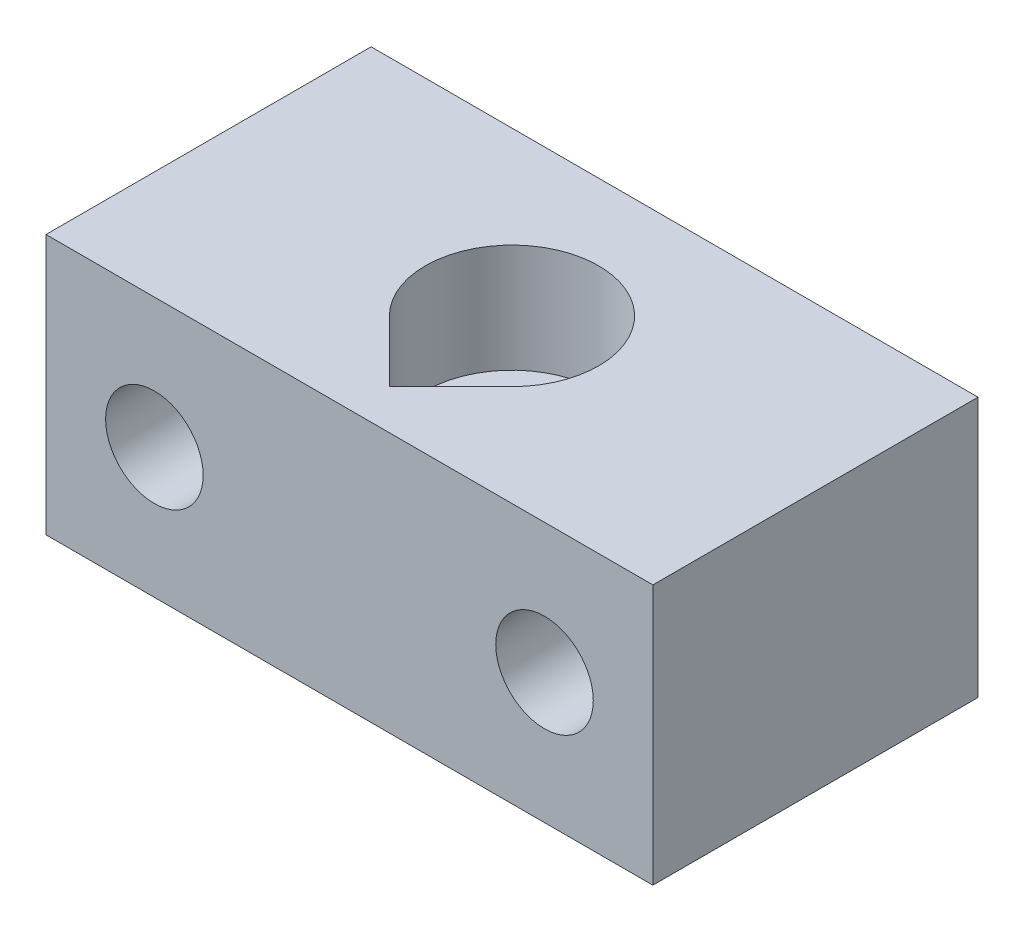
ISO-10303-21;
HEADER;
FILE_DESCRIPTION(('STEP AP214'),'2;1');
FILE_NAME('part.step','',(''),(''),'','','');
FILE_SCHEMA(('AUTOMOTIVE_DESIGN { 1 0 10303 214 1 1 1 1 }'));
ENDSEC;
DATA;
#1=APPLICATION_CONTEXT('core data for automotive mechanical design processes');
#2=APPLICATION_PROTOCOL_DEFINITION('international standard','automotive_design',2000,#1);
#3=PRODUCT_CONTEXT('',#1,'mechanical');
#4=PRODUCT('Part','Part','',(#3));
#5=PRODUCT_RELATED_PRODUCT_CATEGORY('part','',(#4));
#6=PRODUCT_DEFINITION_FORMATION('','',#4);
#7=PRODUCT_DEFINITION_CONTEXT('part definition',#1,'design');
#8=PRODUCT_DEFINITION('design','',#6,#7);
#9=PRODUCT_DEFINITION_SHAPE('','',#8);
#10=(LENGTH_UNIT() NAMED_UNIT(*) SI_UNIT(.MILLI.,.METRE.));
#11=(NAMED_UNIT(*) PLANE_ANGLE_UNIT() SI_UNIT($,.RADIAN.));
#12=(NAMED_UNIT(*) SI_UNIT($,.STERADIAN.) SOLID_ANGLE_UNIT());
#13=UNCERTAINTY_MEASURE_WITH_UNIT(LENGTH_MEASURE(1.E-05),#10,'distance_accuracy_value','');
#14=(GEOMETRIC_REPRESENTATION_CONTEXT(3) GLOBAL_UNCERTAINTY_ASSIGNED_CONTEXT((#13)) GLOBAL_UNIT_ASSIGNED_CONTEXT((#10,
#11,#12)) REPRESENTATION_CONTEXT('',''));
#15=CARTESIAN_POINT('',(0.,0.,0.));
#16=DIRECTION('',(0.,0.,1.));
#17=DIRECTION('',(1.,0.,0.));
#18=AXIS2_PLACEMENT_3D('',#15,#16,#17);
#19=CARTESIAN_POINT('',(0.,12.,-7.5));
#20=DIRECTION('',(0.,-1.,0.));
#21=DIRECTION('',(0.,0.,-1.));
#22=AXIS2_PLACEMENT_3D('',#19,#20,#21);
#23=CYLINDRICAL_SURFACE('',#22,2.25);
#24=DIRECTION('',(0.,-1.,0.));
#25=VECTOR('',#24,1.);
#26=CARTESIAN_POINT('',(1.59099025766973,12.,-5.90900974233027));
#27=LINE('',#26,#25);
#28=CARTESIAN_POINT('',(1.59099025766973,7.,-5.90900974233027));
#29=VERTEX_POINT('',#28);
#30=CARTESIAN_POINT('',(1.59099025766973,0.,-5.90900974233027));
#31=VERTEX_POINT('',#30);
#32=EDGE_CURVE('E172',#29,#31,#27,.T.);
#33=ORIENTED_EDGE('',*,*,#32,.F.);
#34=CARTESIAN_POINT('',(0.,7.,-7.5));
#35=DIRECTION('',(0.,1.,0.));
#36=DIRECTION('',(0.,0.,1.));
#37=AXIS2_PLACEMENT_3D('',#34,#35,#36);
#38=CIRCLE('',#37,2.25);
#39=CARTESIAN_POINT('',(-1.59099025766973,7.,-5.90900974233027));
#40=VERTEX_POINT('',#39);
#41=EDGE_CURVE('E57',#29,#40,#38,.T.);
#42=ORIENTED_EDGE('',*,*,#41,.T.);
#43=DIRECTION('',(0.,-1.,0.));
#44=VECTOR('',#43,1.);
#45=CARTESIAN_POINT('',(-1.59099025766973,12.,-5.90900974233027));
#46=LINE('',#45,#44);
#47=CARTESIAN_POINT('',(-1.59099025766973,0.,-5.90900974233027));
#48=VERTEX_POINT('',#47);
#49=EDGE_CURVE('E176',#40,#48,#46,.T.);
#50=ORIENTED_EDGE('',*,*,#49,.T.);
#51=CARTESIAN_POINT('',(0.,0.,-7.5));
#52=DIRECTION('',(0.,1.,0.));
#53=DIRECTION('',(0.,0.,1.));
#54=AXIS2_PLACEMENT_3D('',#51,#52,#53);
#55=CIRCLE('',#54,2.25);
#56=EDGE_CURVE('E163',#31,#48,#55,.T.);
#57=ORIENTED_EDGE('',*,*,#56,.F.);
#58=EDGE_LOOP('',(#33,#42,#50,#57));
#59=FACE_BOUND('',#58,.T.);
#60=ADVANCED_FACE('F34',(#59),#23,.F.);
#61=CARTESIAN_POINT('',(-1.59099025766973,12.,-5.90900974233027));
#62=DIRECTION('',(0.707106781186548,0.,-0.707106781186547));
#63=DIRECTION('',(-0.707106781186547,0.,-0.707106781186548));
#64=AXIS2_PLACEMENT_3D('',#61,#62,#63);
#65=PLANE('',#64);
#66=ORIENTED_EDGE('',*,*,#49,.F.);
#67=DIRECTION('',(0.707106781186547,0.,0.707106781186548));
#68=VECTOR('',#67,1.);
#69=CARTESIAN_POINT('',(-1.59099025766973,7.,-5.90900974233027));
#70=LINE('',#69,#68);
#71=CARTESIAN_POINT('',(0.,7.,-4.31801948466054));
#72=VERTEX_POINT('',#71);
#73=EDGE_CURVE('E138',#40,#72,#70,.T.);
#74=ORIENTED_EDGE('',*,*,#73,.T.);
#75=DIRECTION('',(0.,-1.,0.));
#76=VECTOR('',#75,1.);
#77=CARTESIAN_POINT('',(0.,12.,-4.31801948466054));
#78=LINE('',#77,#76);
#79=CARTESIAN_POINT('',(0.,0.,-4.31801948466054));
#80=VERTEX_POINT('',#79);
#81=EDGE_CURVE('E174',#72,#80,#78,.T.);
#82=ORIENTED_EDGE('',*,*,#81,.T.);
#83=DIRECTION('',(0.707106781186547,0.,0.707106781186548));
#84=VECTOR('',#83,1.);
#85=CARTESIAN_POINT('',(-1.59099025766973,0.,-5.90900974233027));
#86=LINE('',#85,#84);
#87=EDGE_CURVE('E166',#48,#80,#86,.T.);
#88=ORIENTED_EDGE('',*,*,#87,.F.);
#89=EDGE_LOOP('',(#66,#74,#82,#88));
#90=FACE_BOUND('',#89,.T.);
#91=ADVANCED_FACE('F247',(#90),#65,.T.);
#92=CARTESIAN_POINT('',(0.,12.,-4.31801948466054));
#93=DIRECTION('',(-0.707106781186548,0.,-0.707106781186547));
#94=DIRECTION('',(-0.707106781186547,0.,0.707106781186548));
#95=AXIS2_PLACEMENT_3D('',#92,#93,#94);
#96=PLANE('',#95);
#97=ORIENTED_EDGE('',*,*,#81,.F.);
#98=DIRECTION('',(0.707106781186547,0.,-0.707106781186548));
#99=VECTOR('',#98,1.);
#100=CARTESIAN_POINT('',(0.,7.,-4.31801948466054));
#101=LINE('',#100,#99);
#102=EDGE_CURVE('E11',#72,#29,#101,.T.);
#103=ORIENTED_EDGE('',*,*,#102,.T.);
#104=ORIENTED_EDGE('',*,*,#32,.T.);
#105=DIRECTION('',(0.707106781186547,0.,-0.707106781186548));
#106=VECTOR('',#105,1.);
#107=CARTESIAN_POINT('',(0.,0.,-4.31801948466054));
#108=LINE('',#107,#106);
#109=EDGE_CURVE('E169',#80,#31,#108,.T.);
#110=ORIENTED_EDGE('',*,*,#109,.F.);
#111=EDGE_LOOP('',(#97,#103,#104,#110));
#112=FACE_BOUND('',#111,.T.);
#113=ADVANCED_FACE('F239',(#112),#96,.T.);
#114=CARTESIAN_POINT('',(0.,12.,0.));
#115=DIRECTION('',(0.,1.,0.));
#116=DIRECTION('',(0.,0.,1.));
#117=AXIS2_PLACEMENT_3D('',#114,#115,#116);
#118=PLANE('',#117);
#119=CARTESIAN_POINT('',(0.,12.,-7.5));
#120=DIRECTION('',(0.,1.,0.));
#121=DIRECTION('',(0.,0.,1.));
#122=AXIS2_PLACEMENT_3D('',#119,#120,#121);
#123=CIRCLE('',#122,4.);
#124=CARTESIAN_POINT('',(2.82842712474619,12.,-4.67157287525381));
#125=VERTEX_POINT('',#124);
#126=CARTESIAN_POINT('',(-2.82842712474619,12.,-4.67157287525381));
#127=VERTEX_POINT('',#126);
#128=EDGE_CURVE('E49',#125,#127,#123,.T.);
#129=ORIENTED_EDGE('',*,*,#128,.F.);
#130=DIRECTION('',(0.707106781186547,0.,-0.707106781186548));
#131=VECTOR('',#130,1.);
#132=CARTESIAN_POINT('',(0.,12.,-1.84314575050762));
#133=LINE('',#132,#131);
#134=CARTESIAN_POINT('',(0.,12.,-1.84314575050762));
#135=VERTEX_POINT('',#134);
#136=EDGE_CURVE('E127',#135,#125,#133,.T.);
#137=ORIENTED_EDGE('',*,*,#136,.F.);
#138=DIRECTION('',(0.707106781186547,0.,0.707106781186548));
#139=VECTOR('',#138,1.);
#140=CARTESIAN_POINT('',(-2.82842712474619,12.,-4.67157287525381));
#141=LINE('',#140,#139);
#142=EDGE_CURVE('E130',#127,#135,#141,.T.);
#143=ORIENTED_EDGE('',*,*,#142,.F.);
#144=EDGE_LOOP('',(#129,#137,#143));
#145=FACE_BOUND('',#144,.T.);
#146=DIRECTION('',(-1.,0.,0.));
#147=VECTOR('',#146,1.);
#148=CARTESIAN_POINT('',(-14.,12.,0.));
#149=LINE('',#148,#147);
#150=CARTESIAN_POINT('',(14.,12.,0.));
#151=VERTEX_POINT('',#150);
#152=CARTESIAN_POINT('',(-14.,12.,0.));
#153=VERTEX_POINT('',#152);
#154=EDGE_CURVE('E143',#151,#153,#149,.T.);
#155=ORIENTED_EDGE('',*,*,#154,.F.);
#156=DIRECTION('',(0.,0.,-1.));
#157=VECTOR('',#156,1.);
#158=CARTESIAN_POINT('',(14.,12.,-15.));
#159=LINE('',#158,#157);
#160=CARTESIAN_POINT('',(14.,12.,-15.));
#161=VERTEX_POINT('',#160);
#162=EDGE_CURVE('E182',#151,#161,#159,.T.);
#163=ORIENTED_EDGE('',*,*,#162,.T.);
#164=DIRECTION('',(-1.,0.,0.));
#165=VECTOR('',#164,1.);
#166=CARTESIAN_POINT('',(-14.,12.,-15.));
#167=LINE('',#166,#165);
#168=CARTESIAN_POINT('',(-14.,12.,-15.));
#169=VERTEX_POINT('',#168);
#170=EDGE_CURVE('E185',#161,#169,#167,.T.);
#171=ORIENTED_EDGE('',*,*,#170,.T.);
#172=DIRECTION('',(0.,0.,1.));
#173=VECTOR('',#172,1.);
#174=CARTESIAN_POINT('',(-14.,12.,-15.));
#175=LINE('',#174,#173);
#176=EDGE_CURVE('E179',#169,#153,#175,.T.);
#177=ORIENTED_EDGE('',*,*,#176,.T.);
#178=EDGE_LOOP('',(#155,#163,#171,#177));
#179=FACE_BOUND('',#178,.T.);
#180=ADVANCED_FACE('F237',(#145,#179),#118,.T.);
#181=CARTESIAN_POINT('',(0.,0.,0.));
#182=DIRECTION('',(0.,1.,0.));
#183=DIRECTION('',(0.,0.,1.));
#184=AXIS2_PLACEMENT_3D('',#181,#182,#183);
#185=PLANE('',#184);
#186=DIRECTION('',(0.,0.,-1.));
#187=VECTOR('',#186,1.);
#188=CARTESIAN_POINT('',(14.,0.,-15.));
#189=LINE('',#188,#187);
#190=CARTESIAN_POINT('',(14.,0.,0.));
#191=VERTEX_POINT('',#190);
#192=CARTESIAN_POINT('',(14.,0.,-15.));
#193=VERTEX_POINT('',#192);
#194=EDGE_CURVE('E190',#191,#193,#189,.T.);
#195=ORIENTED_EDGE('',*,*,#194,.F.);
#196=DIRECTION('',(-1.,0.,0.));
#197=VECTOR('',#196,1.);
#198=CARTESIAN_POINT('',(-14.,0.,0.));
#199=LINE('',#198,#197);
#200=CARTESIAN_POINT('',(-14.,0.,0.));
#201=VERTEX_POINT('',#200);
#202=EDGE_CURVE('E144',#191,#201,#199,.T.);
#203=ORIENTED_EDGE('',*,*,#202,.T.);
#204=DIRECTION('',(0.,0.,1.));
#205=VECTOR('',#204,1.);
#206=CARTESIAN_POINT('',(-14.,0.,-15.));
#207=LINE('',#206,#205);
#208=CARTESIAN_POINT('',(-14.,0.,-15.));
#209=VERTEX_POINT('',#208);
#210=EDGE_CURVE('E178',#209,#201,#207,.T.);
#211=ORIENTED_EDGE('',*,*,#210,.F.);
#212=DIRECTION('',(-1.,0.,0.));
#213=VECTOR('',#212,1.);
#214=CARTESIAN_POINT('',(-14.,0.,-15.));
#215=LINE('',#214,#213);
#216=EDGE_CURVE('E183',#193,#209,#215,.T.);
#217=ORIENTED_EDGE('',*,*,#216,.F.);
#218=EDGE_LOOP('',(#195,#203,#211,#217));
#219=FACE_BOUND('',#218,.T.);
#220=ORIENTED_EDGE('',*,*,#56,.T.);
#221=ORIENTED_EDGE('',*,*,#87,.T.);
#222=ORIENTED_EDGE('',*,*,#109,.T.);
#223=EDGE_LOOP('',(#220,#221,#222));
#224=FACE_BOUND('',#223,.T.);
#225=ADVANCED_FACE('F231',(#219,#224),#185,.F.);
#226=CARTESIAN_POINT('',(-14.,12.,-15.));
#227=DIRECTION('',(1.,0.,0.));
#228=DIRECTION('',(0.,0.,-1.));
#229=AXIS2_PLACEMENT_3D('',#226,#227,#228);
#230=PLANE('',#229);
#231=ORIENTED_EDGE('',*,*,#210,.T.);
#232=DIRECTION('',(0.,1.,0.));
#233=VECTOR('',#232,1.);
#234=CARTESIAN_POINT('',(-14.,0.,0.));
#235=LINE('',#234,#233);
#236=EDGE_CURVE('E149',#201,#153,#235,.T.);
#237=ORIENTED_EDGE('',*,*,#236,.T.);
#238=ORIENTED_EDGE('',*,*,#176,.F.);
#239=DIRECTION('',(0.,-1.,0.));
#240=VECTOR('',#239,1.);
#241=CARTESIAN_POINT('',(-14.,12.,-15.));
#242=LINE('',#241,#240);
#243=EDGE_CURVE('E187',#169,#209,#242,.T.);
#244=ORIENTED_EDGE('',*,*,#243,.T.);
#245=EDGE_LOOP('',(#231,#237,#238,#244));
#246=FACE_BOUND('',#245,.T.);
#247=ADVANCED_FACE('F36',(#246),#230,.F.);
#248=CARTESIAN_POINT('',(14.,12.,-15.));
#249=DIRECTION('',(-1.,0.,0.));
#250=DIRECTION('',(0.,0.,1.));
#251=AXIS2_PLACEMENT_3D('',#248,#249,#250);
#252=PLANE('',#251);
#253=ORIENTED_EDGE('',*,*,#162,.F.);
#254=DIRECTION('',(0.,1.,0.));
#255=VECTOR('',#254,1.);
#256=CARTESIAN_POINT('',(14.,0.,0.));
#257=LINE('',#256,#255);
#258=EDGE_CURVE('E147',#191,#151,#257,.T.);
#259=ORIENTED_EDGE('',*,*,#258,.F.);
#260=ORIENTED_EDGE('',*,*,#194,.T.);
#261=DIRECTION('',(0.,-1.,0.));
#262=VECTOR('',#261,1.);
#263=CARTESIAN_POINT('',(14.,12.,-15.));
#264=LINE('',#263,#262);
#265=EDGE_CURVE('E42',#161,#193,#264,.T.);
#266=ORIENTED_EDGE('',*,*,#265,.F.);
#267=EDGE_LOOP('',(#253,#259,#260,#266));
#268=FACE_BOUND('',#267,.T.);
#269=ADVANCED_FACE('F219',(#268),#252,.F.);
#270=CARTESIAN_POINT('',(-14.,12.,-15.));
#271=DIRECTION('',(0.,0.,1.));
#272=DIRECTION('',(1.,0.,0.));
#273=AXIS2_PLACEMENT_3D('',#270,#271,#272);
#274=PLANE('',#273);
#275=CARTESIAN_POINT('',(9.,6.,-15.));
#276=DIRECTION('',(0.,0.,1.));
#277=DIRECTION('',(1.,0.,0.));
#278=AXIS2_PLACEMENT_3D('',#275,#276,#277);
#279=CIRCLE('',#278,2.25);
#280=CARTESIAN_POINT('',(11.25,6.,-15.));
#281=VERTEX_POINT('',#280);
#282=EDGE_CURVE('E157',#281,#281,#279,.T.);
#283=ORIENTED_EDGE('',*,*,#282,.T.);
#284=EDGE_LOOP('',(#283));
#285=FACE_BOUND('',#284,.T.);
#286=CARTESIAN_POINT('',(-9.,6.,-15.));
#287=DIRECTION('',(0.,0.,1.));
#288=DIRECTION('',(1.,0.,0.));
#289=AXIS2_PLACEMENT_3D('',#286,#287,#288);
#290=CIRCLE('',#289,2.25);
#291=CARTESIAN_POINT('',(-6.75,6.,-15.));
#292=VERTEX_POINT('',#291);
#293=EDGE_CURVE('E160',#292,#292,#290,.T.);
#294=ORIENTED_EDGE('',*,*,#293,.T.);
#295=EDGE_LOOP('',(#294));
#296=FACE_BOUND('',#295,.T.);
#297=ORIENTED_EDGE('',*,*,#216,.T.);
#298=ORIENTED_EDGE('',*,*,#243,.F.);
#299=ORIENTED_EDGE('',*,*,#170,.F.);
#300=ORIENTED_EDGE('',*,*,#265,.T.);
#301=EDGE_LOOP('',(#297,#298,#299,#300));
#302=FACE_BOUND('',#301,.T.);
#303=ADVANCED_FACE('F213',(#285,#296,#302),#274,.F.);
#304=CARTESIAN_POINT('',(-9.,6.,-15.));
#305=DIRECTION('',(0.,0.,1.));
#306=DIRECTION('',(1.,0.,0.));
#307=AXIS2_PLACEMENT_3D('',#304,#305,#306);
#308=CYLINDRICAL_SURFACE('',#307,2.25);
#309=CARTESIAN_POINT('',(-9.,6.,0.));
#310=DIRECTION('',(0.,0.,-1.));
#311=DIRECTION('',(-1.,0.,0.));
#312=AXIS2_PLACEMENT_3D('',#309,#310,#311);
#313=CIRCLE('',#312,2.25);
#314=CARTESIAN_POINT('',(-11.25,6.,0.));
#315=VERTEX_POINT('',#314);
#316=EDGE_CURVE('E154',#315,#315,#313,.F.);
#317=ORIENTED_EDGE('',*,*,#316,.T.);
#318=EDGE_LOOP('',(#317));
#319=FACE_BOUND('',#318,.T.);
#320=ORIENTED_EDGE('',*,*,#293,.F.);
#321=EDGE_LOOP('',(#320));
#322=FACE_BOUND('',#321,.T.);
#323=ADVANCED_FACE('F210',(#319,#322),#308,.F.);
#324=CARTESIAN_POINT('',(9.,6.,-15.));
#325=DIRECTION('',(0.,0.,1.));
#326=DIRECTION('',(1.,0.,0.));
#327=AXIS2_PLACEMENT_3D('',#324,#325,#326);
#328=CYLINDRICAL_SURFACE('',#327,2.25);
#329=CARTESIAN_POINT('',(9.,6.,0.));
#330=DIRECTION('',(0.,0.,-1.));
#331=DIRECTION('',(-1.,0.,0.));
#332=AXIS2_PLACEMENT_3D('',#329,#330,#331);
#333=CIRCLE('',#332,2.25);
#334=CARTESIAN_POINT('',(6.75,6.,0.));
#335=VERTEX_POINT('',#334);
#336=EDGE_CURVE('E152',#335,#335,#333,.F.);
#337=ORIENTED_EDGE('',*,*,#336,.T.);
#338=EDGE_LOOP('',(#337));
#339=FACE_BOUND('',#338,.T.);
#340=ORIENTED_EDGE('',*,*,#282,.F.);
#341=EDGE_LOOP('',(#340));
#342=FACE_BOUND('',#341,.T.);
#343=ADVANCED_FACE('F199',(#339,#342),#328,.F.);
#344=CARTESIAN_POINT('',(-14.,0.,0.));
#345=DIRECTION('',(0.,0.,-1.));
#346=DIRECTION('',(-1.,0.,0.));
#347=AXIS2_PLACEMENT_3D('',#344,#345,#346);
#348=PLANE('',#347);
#349=ORIENTED_EDGE('',*,*,#336,.F.);
#350=EDGE_LOOP('',(#349));
#351=FACE_BOUND('',#350,.T.);
#352=ORIENTED_EDGE('',*,*,#154,.T.);
#353=ORIENTED_EDGE('',*,*,#236,.F.);
#354=ORIENTED_EDGE('',*,*,#202,.F.);
#355=ORIENTED_EDGE('',*,*,#258,.T.);
#356=EDGE_LOOP('',(#352,#353,#354,#355));
#357=FACE_BOUND('',#356,.T.);
#358=ORIENTED_EDGE('',*,*,#316,.F.);
#359=EDGE_LOOP('',(#358));
#360=FACE_BOUND('',#359,.T.);
#361=ADVANCED_FACE('F202',(#351,#357,#360),#348,.F.);
#362=CARTESIAN_POINT('',(0.,7.,-7.5));
#363=DIRECTION('',(0.,1.,0.));
#364=DIRECTION('',(0.,0.,1.));
#365=AXIS2_PLACEMENT_3D('',#362,#363,#364);
#366=CYLINDRICAL_SURFACE('',#365,4.);
#367=ORIENTED_EDGE('',*,*,#128,.T.);
#368=DIRECTION('',(0.,1.,0.));
#369=VECTOR('',#368,1.);
#370=CARTESIAN_POINT('',(-2.82842712474619,7.,-4.67157287525381));
#371=LINE('',#370,#369);
#372=CARTESIAN_POINT('',(-2.82842712474619,7.,-4.67157287525381));
#373=VERTEX_POINT('',#372);
#374=EDGE_CURVE('E108',#373,#127,#371,.T.);
#375=ORIENTED_EDGE('',*,*,#374,.F.);
#376=CARTESIAN_POINT('',(0.,7.,-7.5));
#377=DIRECTION('',(0.,1.,0.));
#378=DIRECTION('',(0.,0.,1.));
#379=AXIS2_PLACEMENT_3D('',#376,#377,#378);
#380=CIRCLE('',#379,4.);
#381=CARTESIAN_POINT('',(2.82842712474619,7.,-4.67157287525381));
#382=VERTEX_POINT('',#381);
#383=EDGE_CURVE('E112',#382,#373,#380,.T.);
#384=ORIENTED_EDGE('',*,*,#383,.F.);
#385=DIRECTION('',(0.,1.,0.));
#386=VECTOR('',#385,1.);
#387=CARTESIAN_POINT('',(2.82842712474619,7.,-4.67157287525381));
#388=LINE('',#387,#386);
#389=EDGE_CURVE('E136',#382,#125,#388,.T.);
#390=ORIENTED_EDGE('',*,*,#389,.T.);
#391=EDGE_LOOP('',(#367,#375,#384,#390));
#392=FACE_BOUND('',#391,.T.);
#393=ADVANCED_FACE('F110',(#392),#366,.F.);
#394=CARTESIAN_POINT('',(0.,7.,-1.84314575050762));
#395=DIRECTION('',(0.707106781186548,0.,0.707106781186547));
#396=DIRECTION('',(0.707106781186547,0.,-0.707106781186548));
#397=AXIS2_PLACEMENT_3D('',#394,#395,#396);
#398=PLANE('',#397);
#399=ORIENTED_EDGE('',*,*,#136,.T.);
#400=ORIENTED_EDGE('',*,*,#389,.F.);
#401=DIRECTION('',(0.707106781186547,0.,-0.707106781186548));
#402=VECTOR('',#401,1.);
#403=CARTESIAN_POINT('',(0.,7.,-1.84314575050762));
#404=LINE('',#403,#402);
#405=CARTESIAN_POINT('',(0.,7.,-1.84314575050762));
#406=VERTEX_POINT('',#405);
#407=EDGE_CURVE('E118',#406,#382,#404,.T.);
#408=ORIENTED_EDGE('',*,*,#407,.F.);
#409=DIRECTION('',(0.,1.,0.));
#410=VECTOR('',#409,1.);
#411=CARTESIAN_POINT('',(0.,7.,-1.84314575050762));
#412=LINE('',#411,#410);
#413=EDGE_CURVE('E117',#406,#135,#412,.T.);
#414=ORIENTED_EDGE('',*,*,#413,.T.);
#415=EDGE_LOOP('',(#399,#400,#408,#414));
#416=FACE_BOUND('',#415,.T.);
#417=ADVANCED_FACE('F264',(#416),#398,.F.);
#418=CARTESIAN_POINT('',(-2.82842712474619,7.,-4.67157287525381));
#419=DIRECTION('',(-0.707106781186548,0.,0.707106781186547));
#420=DIRECTION('',(0.707106781186547,0.,0.707106781186548));
#421=AXIS2_PLACEMENT_3D('',#418,#419,#420);
#422=PLANE('',#421);
#423=ORIENTED_EDGE('',*,*,#142,.T.);
#424=ORIENTED_EDGE('',*,*,#413,.F.);
#425=DIRECTION('',(0.707106781186547,0.,0.707106781186548));
#426=VECTOR('',#425,1.);
#427=CARTESIAN_POINT('',(-2.82842712474619,7.,-4.67157287525381));
#428=LINE('',#427,#426);
#429=EDGE_CURVE('E121',#373,#406,#428,.T.);
#430=ORIENTED_EDGE('',*,*,#429,.F.);
#431=ORIENTED_EDGE('',*,*,#374,.T.);
#432=EDGE_LOOP('',(#423,#424,#430,#431));
#433=FACE_BOUND('',#432,.T.);
#434=ADVANCED_FACE('F122',(#433),#422,.F.);
#435=CARTESIAN_POINT('',(0.,7.,-7.5));
#436=DIRECTION('',(0.,1.,0.));
#437=DIRECTION('',(0.,0.,1.));
#438=AXIS2_PLACEMENT_3D('',#435,#436,#437);
#439=PLANE('',#438);
#440=ORIENTED_EDGE('',*,*,#102,.F.);
#441=ORIENTED_EDGE('',*,*,#73,.F.);
#442=ORIENTED_EDGE('',*,*,#41,.F.);
#443=EDGE_LOOP('',(#440,#441,#442));
#444=FACE_BOUND('',#443,.T.);
#445=ORIENTED_EDGE('',*,*,#383,.T.);
#446=ORIENTED_EDGE('',*,*,#429,.T.);
#447=ORIENTED_EDGE('',*,*,#407,.T.);
#448=EDGE_LOOP('',(#445,#446,#447));
#449=FACE_BOUND('',#448,.T.);
#450=ADVANCED_FACE('F126',(#444,#449),#439,.T.);
#451=CLOSED_SHELL('',(#60,#91,#113,#180,#225,#247,#269,#303,#323,#343,#361,#393,#417,#434,#450));
#452=MANIFOLD_SOLID_BREP('B2',#451);
#453=ADVANCED_BREP_SHAPE_REPRESENTATION('',(#18,#452),#14);
#454=SHAPE_DEFINITION_REPRESENTATION(#9,#453);
ENDSEC;
END-ISO-10303-21;
